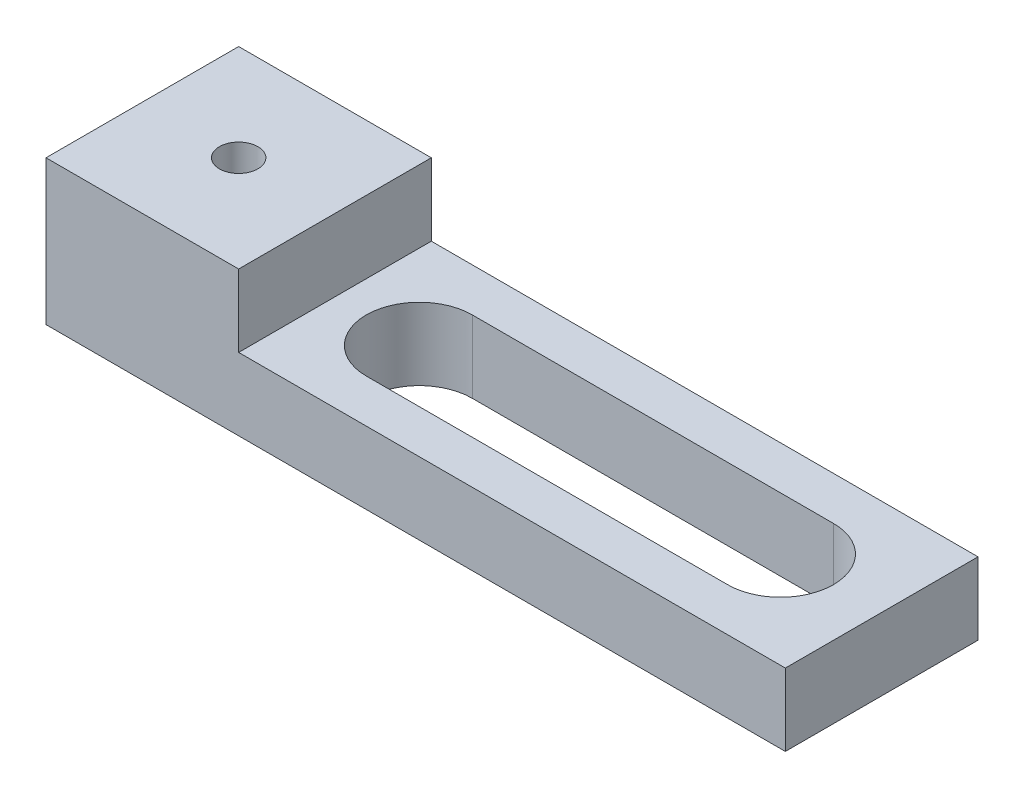
ISO-10303-21;
HEADER;
FILE_DESCRIPTION(('STEP AP214'),'2;1');
FILE_NAME('part.step','',(''),(''),'','','');
FILE_SCHEMA(('AUTOMOTIVE_DESIGN { 1 0 10303 214 1 1 1 1 }'));
ENDSEC;
DATA;
#1=APPLICATION_CONTEXT('core data for automotive mechanical design processes');
#2=APPLICATION_PROTOCOL_DEFINITION('international standard','automotive_design',2000,#1);
#3=PRODUCT_CONTEXT('',#1,'mechanical');
#4=PRODUCT('Part','Part','',(#3));
#5=PRODUCT_RELATED_PRODUCT_CATEGORY('part','',(#4));
#6=PRODUCT_DEFINITION_FORMATION('','',#4);
#7=PRODUCT_DEFINITION_CONTEXT('part definition',#1,'design');
#8=PRODUCT_DEFINITION('design','',#6,#7);
#9=PRODUCT_DEFINITION_SHAPE('','',#8);
#10=(LENGTH_UNIT() NAMED_UNIT(*) SI_UNIT(.MILLI.,.METRE.));
#11=(NAMED_UNIT(*) PLANE_ANGLE_UNIT() SI_UNIT($,.RADIAN.));
#12=(NAMED_UNIT(*) SI_UNIT($,.STERADIAN.) SOLID_ANGLE_UNIT());
#13=UNCERTAINTY_MEASURE_WITH_UNIT(LENGTH_MEASURE(1.E-05),#10,'distance_accuracy_value','');
#14=(GEOMETRIC_REPRESENTATION_CONTEXT(3) GLOBAL_UNCERTAINTY_ASSIGNED_CONTEXT((#13)) GLOBAL_UNIT_ASSIGNED_CONTEXT((#10,
#11,#12)) REPRESENTATION_CONTEXT('',''));
#15=CARTESIAN_POINT('',(0.,0.,0.));
#16=DIRECTION('',(0.,0.,1.));
#17=DIRECTION('',(1.,0.,0.));
#18=AXIS2_PLACEMENT_3D('',#15,#16,#17);
#19=CARTESIAN_POINT('',(0.,3.,0.));
#20=DIRECTION('',(0.,-1.,0.));
#21=DIRECTION('',(0.,0.,-1.));
#22=AXIS2_PLACEMENT_3D('',#19,#20,#21);
#23=PLANE('',#22);
#24=CARTESIAN_POINT('',(0.,3.,0.));
#25=DIRECTION('',(0.,1.,0.));
#26=DIRECTION('',(0.,0.,1.));
#27=AXIS2_PLACEMENT_3D('',#24,#25,#26);
#28=CIRCLE('',#27,2.2);
#29=CARTESIAN_POINT('',(0.,3.,-2.2));
#30=VERTEX_POINT('',#29);
#31=CARTESIAN_POINT('',(0.,3.,2.2));
#32=VERTEX_POINT('',#31);
#33=EDGE_CURVE('E149',#30,#32,#28,.T.);
#34=ORIENTED_EDGE('',*,*,#33,.F.);
#35=DIRECTION('',(-1.,0.,0.));
#36=VECTOR('',#35,1.);
#37=CARTESIAN_POINT('',(0.,3.,-2.2));
#38=LINE('',#37,#36);
#39=CARTESIAN_POINT('',(15.,3.,-2.2));
#40=VERTEX_POINT('',#39);
#41=EDGE_CURVE('E170',#40,#30,#38,.T.);
#42=ORIENTED_EDGE('',*,*,#41,.F.);
#43=CARTESIAN_POINT('',(15.,3.,0.));
#44=DIRECTION('',(0.,1.,0.));
#45=DIRECTION('',(0.,0.,1.));
#46=AXIS2_PLACEMENT_3D('',#43,#44,#45);
#47=CIRCLE('',#46,2.2);
#48=CARTESIAN_POINT('',(15.,3.,2.2));
#49=VERTEX_POINT('',#48);
#50=EDGE_CURVE('E342',#49,#40,#47,.T.);
#51=ORIENTED_EDGE('',*,*,#50,.F.);
#52=DIRECTION('',(1.,0.,0.));
#53=VECTOR('',#52,1.);
#54=CARTESIAN_POINT('',(0.,3.,2.2));
#55=LINE('',#54,#53);
#56=EDGE_CURVE('E344',#32,#49,#55,.T.);
#57=ORIENTED_EDGE('',*,*,#56,.F.);
#58=EDGE_LOOP('',(#34,#42,#51,#57));
#59=FACE_BOUND('',#58,.T.);
#60=DIRECTION('',(0.,0.,-1.));
#61=VECTOR('',#60,1.);
#62=CARTESIAN_POINT('',(-3.5,3.,-4.));
#63=LINE('',#62,#61);
#64=CARTESIAN_POINT('',(-3.5,3.,4.));
#65=VERTEX_POINT('',#64);
#66=CARTESIAN_POINT('',(-3.5,3.,-4.));
#67=VERTEX_POINT('',#66);
#68=EDGE_CURVE('E50',#65,#67,#63,.T.);
#69=ORIENTED_EDGE('',*,*,#68,.F.);
#70=DIRECTION('',(1.,0.,0.));
#71=VECTOR('',#70,1.);
#72=CARTESIAN_POINT('',(19.2,3.,4.));
#73=LINE('',#72,#71);
#74=CARTESIAN_POINT('',(19.2,3.,4.));
#75=VERTEX_POINT('',#74);
#76=EDGE_CURVE('E153',#65,#75,#73,.T.);
#77=ORIENTED_EDGE('',*,*,#76,.T.);
#78=DIRECTION('',(0.,0.,-1.));
#79=VECTOR('',#78,1.);
#80=CARTESIAN_POINT('',(19.2,3.,-4.));
#81=LINE('',#80,#79);
#82=CARTESIAN_POINT('',(19.2,3.,-4.));
#83=VERTEX_POINT('',#82);
#84=EDGE_CURVE('E187',#75,#83,#81,.T.);
#85=ORIENTED_EDGE('',*,*,#84,.T.);
#86=DIRECTION('',(-1.,0.,0.));
#87=VECTOR('',#86,1.);
#88=CARTESIAN_POINT('',(19.2,3.,-4.));
#89=LINE('',#88,#87);
#90=EDGE_CURVE('E190',#83,#67,#89,.T.);
#91=ORIENTED_EDGE('',*,*,#90,.T.);
#92=EDGE_LOOP('',(#69,#77,#85,#91));
#93=FACE_BOUND('',#92,.T.);
#94=ADVANCED_FACE('F33',(#59,#93),#23,.F.);
#95=CARTESIAN_POINT('',(0.,0.,0.));
#96=DIRECTION('',(0.,-1.,0.));
#97=DIRECTION('',(0.,0.,-1.));
#98=AXIS2_PLACEMENT_3D('',#95,#96,#97);
#99=PLANE('',#98);
#100=CARTESIAN_POINT('',(-7.5,0.,0.));
#101=DIRECTION('',(0.,-1.,0.));
#102=DIRECTION('',(0.,0.,-1.));
#103=AXIS2_PLACEMENT_3D('',#100,#101,#102);
#104=CIRCLE('',#103,0.8);
#105=CARTESIAN_POINT('',(-7.5,0.,0.8));
#106=VERTEX_POINT('',#105);
#107=EDGE_CURVE('E141',#106,#106,#104,.F.);
#108=ORIENTED_EDGE('',*,*,#107,.T.);
#109=EDGE_LOOP('',(#108));
#110=FACE_BOUND('',#109,.T.);
#111=DIRECTION('',(0.,0.,-1.));
#112=VECTOR('',#111,1.);
#113=CARTESIAN_POINT('',(19.2,0.,-4.));
#114=LINE('',#113,#112);
#115=CARTESIAN_POINT('',(19.2,0.,4.));
#116=VERTEX_POINT('',#115);
#117=CARTESIAN_POINT('',(19.2,0.,-4.));
#118=VERTEX_POINT('',#117);
#119=EDGE_CURVE('E186',#116,#118,#114,.T.);
#120=ORIENTED_EDGE('',*,*,#119,.F.);
#121=DIRECTION('',(1.,0.,0.));
#122=VECTOR('',#121,1.);
#123=CARTESIAN_POINT('',(19.2,0.,4.));
#124=LINE('',#123,#122);
#125=CARTESIAN_POINT('',(-11.5,0.,4.));
#126=VERTEX_POINT('',#125);
#127=EDGE_CURVE('E191',#126,#116,#124,.T.);
#128=ORIENTED_EDGE('',*,*,#127,.F.);
#129=DIRECTION('',(0.,0.,1.));
#130=VECTOR('',#129,1.);
#131=CARTESIAN_POINT('',(-11.5,0.,-4.));
#132=LINE('',#131,#130);
#133=CARTESIAN_POINT('',(-11.5,0.,-4.));
#134=VERTEX_POINT('',#133);
#135=EDGE_CURVE('E119',#134,#126,#132,.T.);
#136=ORIENTED_EDGE('',*,*,#135,.F.);
#137=DIRECTION('',(-1.,0.,0.));
#138=VECTOR('',#137,1.);
#139=CARTESIAN_POINT('',(19.2,0.,-4.));
#140=LINE('',#139,#138);
#141=EDGE_CURVE('E201',#118,#134,#140,.T.);
#142=ORIENTED_EDGE('',*,*,#141,.F.);
#143=EDGE_LOOP('',(#120,#128,#136,#142));
#144=FACE_BOUND('',#143,.T.);
#145=DIRECTION('',(-1.,0.,0.));
#146=VECTOR('',#145,1.);
#147=CARTESIAN_POINT('',(0.,0.,-2.2));
#148=LINE('',#147,#146);
#149=CARTESIAN_POINT('',(15.,0.,-2.2));
#150=VERTEX_POINT('',#149);
#151=CARTESIAN_POINT('',(0.,0.,-2.2));
#152=VERTEX_POINT('',#151);
#153=EDGE_CURVE('E175',#150,#152,#148,.T.);
#154=ORIENTED_EDGE('',*,*,#153,.T.);
#155=CARTESIAN_POINT('',(0.,0.,0.));
#156=DIRECTION('',(0.,1.,0.));
#157=DIRECTION('',(0.,0.,1.));
#158=AXIS2_PLACEMENT_3D('',#155,#156,#157);
#159=CIRCLE('',#158,2.2);
#160=CARTESIAN_POINT('',(0.,0.,2.2));
#161=VERTEX_POINT('',#160);
#162=EDGE_CURVE('E159',#152,#161,#159,.T.);
#163=ORIENTED_EDGE('',*,*,#162,.T.);
#164=DIRECTION('',(1.,0.,0.));
#165=VECTOR('',#164,1.);
#166=CARTESIAN_POINT('',(0.,0.,2.2));
#167=LINE('',#166,#165);
#168=CARTESIAN_POINT('',(15.,0.,2.2));
#169=VERTEX_POINT('',#168);
#170=EDGE_CURVE('E162',#161,#169,#167,.T.);
#171=ORIENTED_EDGE('',*,*,#170,.T.);
#172=CARTESIAN_POINT('',(15.,0.,0.));
#173=DIRECTION('',(0.,1.,0.));
#174=DIRECTION('',(0.,0.,1.));
#175=AXIS2_PLACEMENT_3D('',#172,#173,#174);
#176=CIRCLE('',#175,2.2);
#177=EDGE_CURVE('E167',#169,#150,#176,.T.);
#178=ORIENTED_EDGE('',*,*,#177,.T.);
#179=EDGE_LOOP('',(#154,#163,#171,#178));
#180=FACE_BOUND('',#179,.T.);
#181=ADVANCED_FACE('F209',(#110,#144,#180),#99,.T.);
#182=CARTESIAN_POINT('',(19.2,3.,-4.));
#183=DIRECTION('',(-1.,0.,0.));
#184=DIRECTION('',(0.,0.,1.));
#185=AXIS2_PLACEMENT_3D('',#182,#183,#184);
#186=PLANE('',#185);
#187=ORIENTED_EDGE('',*,*,#119,.T.);
#188=DIRECTION('',(0.,-1.,0.));
#189=VECTOR('',#188,1.);
#190=CARTESIAN_POINT('',(19.2,3.,-4.));
#191=LINE('',#190,#189);
#192=EDGE_CURVE('E11',#83,#118,#191,.T.);
#193=ORIENTED_EDGE('',*,*,#192,.F.);
#194=ORIENTED_EDGE('',*,*,#84,.F.);
#195=DIRECTION('',(0.,-1.,0.));
#196=VECTOR('',#195,1.);
#197=CARTESIAN_POINT('',(19.2,3.,4.));
#198=LINE('',#197,#196);
#199=EDGE_CURVE('E122',#75,#116,#198,.T.);
#200=ORIENTED_EDGE('',*,*,#199,.T.);
#201=EDGE_LOOP('',(#187,#193,#194,#200));
#202=FACE_BOUND('',#201,.T.);
#203=ADVANCED_FACE('F35',(#202),#186,.F.);
#204=CARTESIAN_POINT('',(19.2,3.,-4.));
#205=DIRECTION('',(0.,0.,1.));
#206=DIRECTION('',(1.,0.,0.));
#207=AXIS2_PLACEMENT_3D('',#204,#205,#206);
#208=PLANE('',#207);
#209=ORIENTED_EDGE('',*,*,#141,.T.);
#210=DIRECTION('',(0.,-1.,0.));
#211=VECTOR('',#210,1.);
#212=CARTESIAN_POINT('',(-11.5,3.,-4.));
#213=LINE('',#212,#211);
#214=CARTESIAN_POINT('',(-11.5,6.,-4.));
#215=VERTEX_POINT('',#214);
#216=EDGE_CURVE('E42',#215,#134,#213,.T.);
#217=ORIENTED_EDGE('',*,*,#216,.F.);
#218=DIRECTION('',(-1.,0.,0.));
#219=VECTOR('',#218,1.);
#220=CARTESIAN_POINT('',(-11.5,6.,-4.));
#221=LINE('',#220,#219);
#222=CARTESIAN_POINT('',(-3.5,6.,-4.));
#223=VERTEX_POINT('',#222);
#224=EDGE_CURVE('E136',#223,#215,#221,.T.);
#225=ORIENTED_EDGE('',*,*,#224,.F.);
#226=DIRECTION('',(0.,-1.,0.));
#227=VECTOR('',#226,1.);
#228=CARTESIAN_POINT('',(-3.5,6.,-4.));
#229=LINE('',#228,#227);
#230=EDGE_CURVE('E146',#223,#67,#229,.T.);
#231=ORIENTED_EDGE('',*,*,#230,.T.);
#232=ORIENTED_EDGE('',*,*,#90,.F.);
#233=ORIENTED_EDGE('',*,*,#192,.T.);
#234=EDGE_LOOP('',(#209,#217,#225,#231,#232,#233));
#235=FACE_BOUND('',#234,.T.);
#236=ADVANCED_FACE('F211',(#235),#208,.F.);
#237=CARTESIAN_POINT('',(-11.5,3.,-4.));
#238=DIRECTION('',(1.,0.,0.));
#239=DIRECTION('',(0.,0.,-1.));
#240=AXIS2_PLACEMENT_3D('',#237,#238,#239);
#241=PLANE('',#240);
#242=ORIENTED_EDGE('',*,*,#135,.T.);
#243=DIRECTION('',(0.,-1.,0.));
#244=VECTOR('',#243,1.);
#245=CARTESIAN_POINT('',(-11.5,3.,4.));
#246=LINE('',#245,#244);
#247=CARTESIAN_POINT('',(-11.5,6.,4.));
#248=VERTEX_POINT('',#247);
#249=EDGE_CURVE('E112',#248,#126,#246,.T.);
#250=ORIENTED_EDGE('',*,*,#249,.F.);
#251=DIRECTION('',(0.,0.,1.));
#252=VECTOR('',#251,1.);
#253=CARTESIAN_POINT('',(-11.5,6.,-4.));
#254=LINE('',#253,#252);
#255=EDGE_CURVE('E117',#215,#248,#254,.T.);
#256=ORIENTED_EDGE('',*,*,#255,.F.);
#257=ORIENTED_EDGE('',*,*,#216,.T.);
#258=EDGE_LOOP('',(#242,#250,#256,#257));
#259=FACE_BOUND('',#258,.T.);
#260=ADVANCED_FACE('F114',(#259),#241,.F.);
#261=CARTESIAN_POINT('',(19.2,3.,4.));
#262=DIRECTION('',(0.,0.,-1.));
#263=DIRECTION('',(-1.,0.,0.));
#264=AXIS2_PLACEMENT_3D('',#261,#262,#263);
#265=PLANE('',#264);
#266=ORIENTED_EDGE('',*,*,#127,.T.);
#267=ORIENTED_EDGE('',*,*,#199,.F.);
#268=ORIENTED_EDGE('',*,*,#76,.F.);
#269=DIRECTION('',(0.,-1.,0.));
#270=VECTOR('',#269,1.);
#271=CARTESIAN_POINT('',(-3.5,6.,4.));
#272=LINE('',#271,#270);
#273=CARTESIAN_POINT('',(-3.5,6.,4.));
#274=VERTEX_POINT('',#273);
#275=EDGE_CURVE('E128',#274,#65,#272,.T.);
#276=ORIENTED_EDGE('',*,*,#275,.F.);
#277=DIRECTION('',(1.,0.,0.));
#278=VECTOR('',#277,1.);
#279=CARTESIAN_POINT('',(-11.5,6.,4.));
#280=LINE('',#279,#278);
#281=EDGE_CURVE('E125',#248,#274,#280,.T.);
#282=ORIENTED_EDGE('',*,*,#281,.F.);
#283=ORIENTED_EDGE('',*,*,#249,.T.);
#284=EDGE_LOOP('',(#266,#267,#268,#276,#282,#283));
#285=FACE_BOUND('',#284,.T.);
#286=ADVANCED_FACE('F126',(#285),#265,.F.);
#287=CARTESIAN_POINT('',(0.,3.,0.));
#288=DIRECTION('',(0.,-1.,0.));
#289=DIRECTION('',(0.,0.,-1.));
#290=AXIS2_PLACEMENT_3D('',#287,#288,#289);
#291=CYLINDRICAL_SURFACE('',#290,2.2);
#292=ORIENTED_EDGE('',*,*,#162,.F.);
#293=DIRECTION('',(0.,-1.,0.));
#294=VECTOR('',#293,1.);
#295=CARTESIAN_POINT('',(0.,3.,-2.2));
#296=LINE('',#295,#294);
#297=EDGE_CURVE('E177',#30,#152,#296,.T.);
#298=ORIENTED_EDGE('',*,*,#297,.F.);
#299=ORIENTED_EDGE('',*,*,#33,.T.);
#300=DIRECTION('',(0.,-1.,0.));
#301=VECTOR('',#300,1.);
#302=CARTESIAN_POINT('',(0.,3.,2.2));
#303=LINE('',#302,#301);
#304=EDGE_CURVE('E183',#32,#161,#303,.T.);
#305=ORIENTED_EDGE('',*,*,#304,.T.);
#306=EDGE_LOOP('',(#292,#298,#299,#305));
#307=FACE_BOUND('',#306,.T.);
#308=ADVANCED_FACE('F224',(#307),#291,.F.);
#309=CARTESIAN_POINT('',(0.,3.,2.2));
#310=DIRECTION('',(0.,0.,-1.));
#311=DIRECTION('',(-1.,0.,0.));
#312=AXIS2_PLACEMENT_3D('',#309,#310,#311);
#313=PLANE('',#312);
#314=ORIENTED_EDGE('',*,*,#170,.F.);
#315=ORIENTED_EDGE('',*,*,#304,.F.);
#316=ORIENTED_EDGE('',*,*,#56,.T.);
#317=DIRECTION('',(0.,-1.,0.));
#318=VECTOR('',#317,1.);
#319=CARTESIAN_POINT('',(15.,3.,2.2));
#320=LINE('',#319,#318);
#321=EDGE_CURVE('E181',#49,#169,#320,.T.);
#322=ORIENTED_EDGE('',*,*,#321,.T.);
#323=EDGE_LOOP('',(#314,#315,#316,#322));
#324=FACE_BOUND('',#323,.T.);
#325=ADVANCED_FACE('F314',(#324),#313,.T.);
#326=CARTESIAN_POINT('',(15.,3.,0.));
#327=DIRECTION('',(0.,-1.,0.));
#328=DIRECTION('',(0.,0.,-1.));
#329=AXIS2_PLACEMENT_3D('',#326,#327,#328);
#330=CYLINDRICAL_SURFACE('',#329,2.2);
#331=ORIENTED_EDGE('',*,*,#177,.F.);
#332=ORIENTED_EDGE('',*,*,#321,.F.);
#333=ORIENTED_EDGE('',*,*,#50,.T.);
#334=DIRECTION('',(0.,-1.,0.));
#335=VECTOR('',#334,1.);
#336=CARTESIAN_POINT('',(15.,3.,-2.2));
#337=LINE('',#336,#335);
#338=EDGE_CURVE('E58',#40,#150,#337,.T.);
#339=ORIENTED_EDGE('',*,*,#338,.T.);
#340=EDGE_LOOP('',(#331,#332,#333,#339));
#341=FACE_BOUND('',#340,.T.);
#342=ADVANCED_FACE('F306',(#341),#330,.F.);
#343=CARTESIAN_POINT('',(0.,3.,-2.2));
#344=DIRECTION('',(0.,0.,1.));
#345=DIRECTION('',(1.,0.,0.));
#346=AXIS2_PLACEMENT_3D('',#343,#344,#345);
#347=PLANE('',#346);
#348=ORIENTED_EDGE('',*,*,#153,.F.);
#349=ORIENTED_EDGE('',*,*,#338,.F.);
#350=ORIENTED_EDGE('',*,*,#41,.T.);
#351=ORIENTED_EDGE('',*,*,#297,.T.);
#352=EDGE_LOOP('',(#348,#349,#350,#351));
#353=FACE_BOUND('',#352,.T.);
#354=ADVANCED_FACE('F272',(#353),#347,.T.);
#355=CARTESIAN_POINT('',(-3.5,6.,-4.));
#356=DIRECTION('',(-1.,0.,0.));
#357=DIRECTION('',(0.,0.,1.));
#358=AXIS2_PLACEMENT_3D('',#355,#356,#357);
#359=PLANE('',#358);
#360=ORIENTED_EDGE('',*,*,#68,.T.);
#361=ORIENTED_EDGE('',*,*,#230,.F.);
#362=DIRECTION('',(0.,0.,-1.));
#363=VECTOR('',#362,1.);
#364=CARTESIAN_POINT('',(-3.5,6.,-4.));
#365=LINE('',#364,#363);
#366=EDGE_CURVE('E131',#274,#223,#365,.T.);
#367=ORIENTED_EDGE('',*,*,#366,.F.);
#368=ORIENTED_EDGE('',*,*,#275,.T.);
#369=EDGE_LOOP('',(#360,#361,#367,#368));
#370=FACE_BOUND('',#369,.T.);
#371=ADVANCED_FACE('F246',(#370),#359,.F.);
#372=CARTESIAN_POINT('',(0.,6.,0.));
#373=DIRECTION('',(0.,1.,0.));
#374=DIRECTION('',(0.,0.,1.));
#375=AXIS2_PLACEMENT_3D('',#372,#373,#374);
#376=PLANE('',#375);
#377=CARTESIAN_POINT('',(-7.5,6.,0.));
#378=DIRECTION('',(0.,1.,0.));
#379=DIRECTION('',(0.,0.,1.));
#380=AXIS2_PLACEMENT_3D('',#377,#378,#379);
#381=CIRCLE('',#380,0.8);
#382=CARTESIAN_POINT('',(-7.5,6.,0.8));
#383=VERTEX_POINT('',#382);
#384=EDGE_CURVE('E138',#383,#383,#381,.T.);
#385=ORIENTED_EDGE('',*,*,#384,.F.);
#386=EDGE_LOOP('',(#385));
#387=FACE_BOUND('',#386,.T.);
#388=ORIENTED_EDGE('',*,*,#255,.T.);
#389=ORIENTED_EDGE('',*,*,#281,.T.);
#390=ORIENTED_EDGE('',*,*,#366,.T.);
#391=ORIENTED_EDGE('',*,*,#224,.T.);
#392=EDGE_LOOP('',(#388,#389,#390,#391));
#393=FACE_BOUND('',#392,.T.);
#394=ADVANCED_FACE('F134',(#387,#393),#376,.T.);
#395=CARTESIAN_POINT('',(-7.5,-0.00100000000000013,0.));
#396=DIRECTION('',(0.,1.,0.));
#397=DIRECTION('',(0.,0.,1.));
#398=AXIS2_PLACEMENT_3D('',#395,#396,#397);
#399=CYLINDRICAL_SURFACE('',#398,0.8);
#400=CARTESIAN_POINT('',(-7.5,0.,0.8));
#401=CARTESIAN_POINT('',(-7.5,0.0624999999999999,0.8));
#402=CARTESIAN_POINT('',(-7.5,0.125,0.8));
#403=CARTESIAN_POINT('',(-7.5,0.25,0.8));
#404=CARTESIAN_POINT('',(-7.5,0.3125,0.8));
#405=CARTESIAN_POINT('',(-7.5,0.4375,0.8));
#406=CARTESIAN_POINT('',(-7.5,0.5,0.8));
#407=CARTESIAN_POINT('',(-7.5,0.625,0.8));
#408=CARTESIAN_POINT('',(-7.5,0.6875,0.8));
#409=CARTESIAN_POINT('',(-7.5,0.8125,0.8));
#410=CARTESIAN_POINT('',(-7.5,0.875,0.8));
#411=CARTESIAN_POINT('',(-7.5,1.,0.8));
#412=CARTESIAN_POINT('',(-7.5,1.0625,0.8));
#413=CARTESIAN_POINT('',(-7.5,1.1875,0.8));
#414=CARTESIAN_POINT('',(-7.5,1.25,0.8));
#415=CARTESIAN_POINT('',(-7.5,1.375,0.8));
#416=CARTESIAN_POINT('',(-7.5,1.4375,0.8));
#417=CARTESIAN_POINT('',(-7.5,1.5625,0.8));
#418=CARTESIAN_POINT('',(-7.5,1.625,0.8));
#419=CARTESIAN_POINT('',(-7.5,1.75,0.8));
#420=CARTESIAN_POINT('',(-7.5,1.8125,0.8));
#421=CARTESIAN_POINT('',(-7.5,1.9375,0.8));
#422=CARTESIAN_POINT('',(-7.5,2.,0.8));
#423=CARTESIAN_POINT('',(-7.5,2.125,0.8));
#424=CARTESIAN_POINT('',(-7.5,2.1875,0.8));
#425=CARTESIAN_POINT('',(-7.5,2.3125,0.8));
#426=CARTESIAN_POINT('',(-7.5,2.375,0.8));
#427=CARTESIAN_POINT('',(-7.5,2.5,0.8));
#428=CARTESIAN_POINT('',(-7.5,2.5625,0.8));
#429=CARTESIAN_POINT('',(-7.5,2.6875,0.8));
#430=CARTESIAN_POINT('',(-7.5,2.75,0.8));
#431=CARTESIAN_POINT('',(-7.5,2.875,0.8));
#432=CARTESIAN_POINT('',(-7.5,2.9375,0.8));
#433=CARTESIAN_POINT('',(-7.5,3.0625,0.8));
#434=CARTESIAN_POINT('',(-7.5,3.125,0.8));
#435=CARTESIAN_POINT('',(-7.5,3.25,0.8));
#436=CARTESIAN_POINT('',(-7.5,3.3125,0.8));
#437=CARTESIAN_POINT('',(-7.5,3.4375,0.8));
#438=CARTESIAN_POINT('',(-7.5,3.5,0.8));
#439=CARTESIAN_POINT('',(-7.5,3.625,0.8));
#440=CARTESIAN_POINT('',(-7.5,3.6875,0.8));
#441=CARTESIAN_POINT('',(-7.5,3.8125,0.8));
#442=CARTESIAN_POINT('',(-7.5,3.875,0.8));
#443=CARTESIAN_POINT('',(-7.5,4.,0.8));
#444=CARTESIAN_POINT('',(-7.5,4.0625,0.8));
#445=CARTESIAN_POINT('',(-7.5,4.1875,0.8));
#446=CARTESIAN_POINT('',(-7.5,4.25,0.8));
#447=CARTESIAN_POINT('',(-7.5,4.375,0.8));
#448=CARTESIAN_POINT('',(-7.5,4.4375,0.8));
#449=CARTESIAN_POINT('',(-7.5,4.5625,0.8));
#450=CARTESIAN_POINT('',(-7.5,4.625,0.8));
#451=CARTESIAN_POINT('',(-7.5,4.75,0.8));
#452=CARTESIAN_POINT('',(-7.5,4.8125,0.8));
#453=CARTESIAN_POINT('',(-7.5,4.9375,0.8));
#454=CARTESIAN_POINT('',(-7.5,5.,0.8));
#455=CARTESIAN_POINT('',(-7.5,5.125,0.8));
#456=CARTESIAN_POINT('',(-7.5,5.1875,0.8));
#457=CARTESIAN_POINT('',(-7.5,5.3125,0.8));
#458=CARTESIAN_POINT('',(-7.5,5.375,0.8));
#459=CARTESIAN_POINT('',(-7.5,5.5,0.8));
#460=CARTESIAN_POINT('',(-7.5,5.5625,0.8));
#461=CARTESIAN_POINT('',(-7.5,5.6875,0.8));
#462=CARTESIAN_POINT('',(-7.5,5.75,0.8));
#463=CARTESIAN_POINT('',(-7.5,5.875,0.8));
#464=CARTESIAN_POINT('',(-7.5,5.9375,0.8));
#465=CARTESIAN_POINT('',(-7.5,6.,0.8));
#466=B_SPLINE_CURVE_WITH_KNOTS('',3,(#400,#401,#402,#403,#404,#405,#406,#407,#408,#409,#410,
#411,#412,#413,#414,#415,#416,#417,#418,#419,#420,#421,#422,#423,#424,#425,#426,#427,#428,#429,
#430,#431,#432,#433,#434,#435,#436,#437,#438,#439,#440,#441,#442,#443,#444,#445,#446,#447,#448,
#449,#450,#451,#452,#453,#454,#455,#456,#457,#458,#459,#460,#461,#462,#463,#464,#465),
.UNSPECIFIED.,.F.,.F.,(4,2,2,2,2,2,2,2,2,2,2,2,2,2,2,2,2,2,2,2,2,2,2,2,2,2,2,2,2,2,2,2,4),(0.,
0.1875,0.375,0.5625,0.75,0.9375,1.125,1.3125,1.5,1.6875,1.875,2.0625,2.25,2.4375,2.625,2.8125,
3.,3.1875,3.375,3.5625,3.75,3.9375,4.125,4.3125,4.5,4.6875,4.875,5.0625,5.25,5.4375,5.625,
5.8125,6.),.UNSPECIFIED.);
#467=EDGE_CURVE('BSEAM254',#106,#383,#466,.T.);
#468=ORIENTED_EDGE('',*,*,#107,.F.);
#469=ORIENTED_EDGE('',*,*,#384,.T.);
#470=ORIENTED_EDGE('',*,*,#467,.T.);
#471=ORIENTED_EDGE('',*,*,#467,.F.);
#472=EDGE_LOOP('',(#468,#470,#469,#471));
#473=FACE_BOUND('',#472,.T.);
#474=ADVANCED_FACE('F254',(#473),#399,.F.);
#475=CLOSED_SHELL('',(#94,#181,#203,#236,#260,#286,#308,#325,#342,#354,#371,#394,#474));
#476=MANIFOLD_SOLID_BREP('B2',#475);
#477=ADVANCED_BREP_SHAPE_REPRESENTATION('',(#18,#476),#14);
#478=SHAPE_DEFINITION_REPRESENTATION(#9,#477);
ENDSEC;
END-ISO-10303-21;
